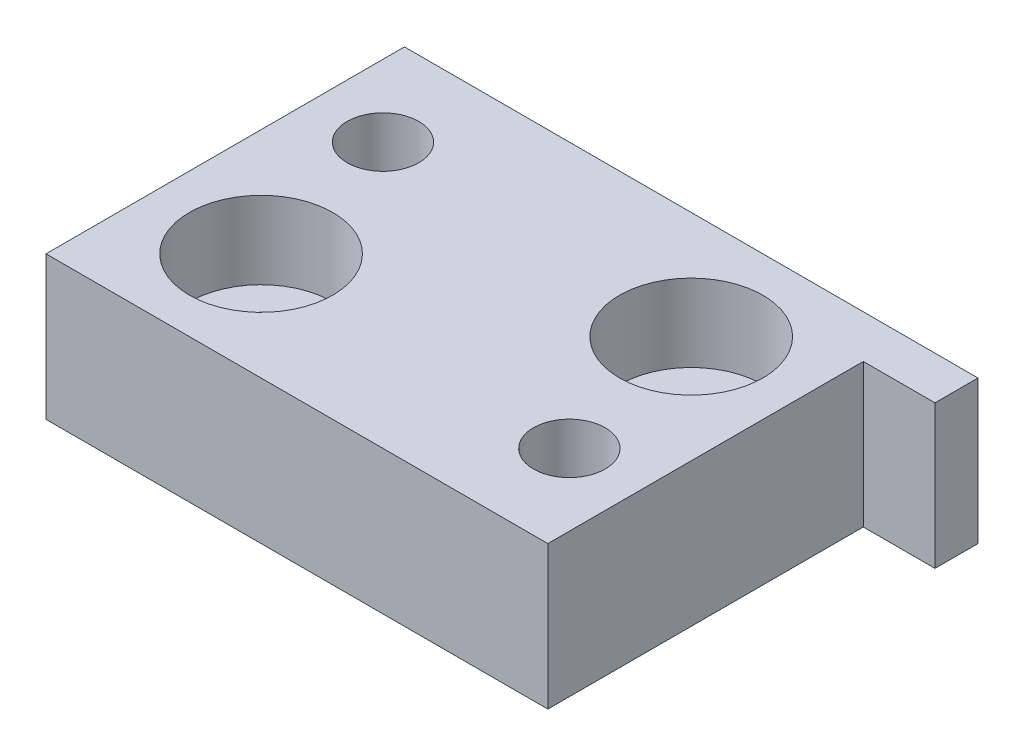
ISO-10303-21;
HEADER;
FILE_DESCRIPTION(('STEP AP214'),'2;1');
FILE_NAME('part.step','',(''),(''),'','','');
FILE_SCHEMA(('AUTOMOTIVE_DESIGN { 1 0 10303 214 1 1 1 1 }'));
ENDSEC;
DATA;
#1=APPLICATION_CONTEXT('core data for automotive mechanical design processes');
#2=APPLICATION_PROTOCOL_DEFINITION('international standard','automotive_design',2000,#1);
#3=PRODUCT_CONTEXT('',#1,'mechanical');
#4=PRODUCT('Part','Part','',(#3));
#5=PRODUCT_RELATED_PRODUCT_CATEGORY('part','',(#4));
#6=PRODUCT_DEFINITION_FORMATION('','',#4);
#7=PRODUCT_DEFINITION_CONTEXT('part definition',#1,'design');
#8=PRODUCT_DEFINITION('design','',#6,#7);
#9=PRODUCT_DEFINITION_SHAPE('','',#8);
#10=(LENGTH_UNIT() NAMED_UNIT(*) SI_UNIT(.MILLI.,.METRE.));
#11=(NAMED_UNIT(*) PLANE_ANGLE_UNIT() SI_UNIT($,.RADIAN.));
#12=(NAMED_UNIT(*) SI_UNIT($,.STERADIAN.) SOLID_ANGLE_UNIT());
#13=UNCERTAINTY_MEASURE_WITH_UNIT(LENGTH_MEASURE(1.E-05),#10,'distance_accuracy_value','');
#14=(GEOMETRIC_REPRESENTATION_CONTEXT(3) GLOBAL_UNCERTAINTY_ASSIGNED_CONTEXT((#13)) GLOBAL_UNIT_ASSIGNED_CONTEXT((#10,
#11,#12)) REPRESENTATION_CONTEXT('',''));
#15=CARTESIAN_POINT('',(0.,0.,0.));
#16=DIRECTION('',(0.,0.,1.));
#17=DIRECTION('',(1.,0.,0.));
#18=AXIS2_PLACEMENT_3D('',#15,#16,#17);
#19=CARTESIAN_POINT('',(20.,10.,12.5));
#20=DIRECTION('',(-1.,0.,0.));
#21=DIRECTION('',(0.,0.,1.));
#22=AXIS2_PLACEMENT_3D('',#19,#20,#21);
#23=PLANE('',#22);
#24=DIRECTION('',(0.,0.,-1.));
#25=VECTOR('',#24,1.);
#26=CARTESIAN_POINT('',(20.,10.,12.5));
#27=LINE('',#26,#25);
#28=CARTESIAN_POINT('',(20.,10.,-9.5));
#29=VERTEX_POINT('',#28);
#30=CARTESIAN_POINT('',(20.,10.,-12.5));
#31=VERTEX_POINT('',#30);
#32=EDGE_CURVE('E84',#29,#31,#27,.T.);
#33=ORIENTED_EDGE('',*,*,#32,.F.);
#34=DIRECTION('',(0.,1.,0.));
#35=VECTOR('',#34,1.);
#36=CARTESIAN_POINT('',(20.,-0.000999999999999265,-9.5));
#37=LINE('',#36,#35);
#38=CARTESIAN_POINT('',(20.,0.,-9.5));
#39=VERTEX_POINT('',#38);
#40=EDGE_CURVE('E139',#39,#29,#37,.T.);
#41=ORIENTED_EDGE('',*,*,#40,.F.);
#42=DIRECTION('',(0.,0.,-1.));
#43=VECTOR('',#42,1.);
#44=CARTESIAN_POINT('',(20.,0.,12.5));
#45=LINE('',#44,#43);
#46=CARTESIAN_POINT('',(20.,0.,-12.5));
#47=VERTEX_POINT('',#46);
#48=EDGE_CURVE('E134',#39,#47,#45,.T.);
#49=ORIENTED_EDGE('',*,*,#48,.T.);
#50=DIRECTION('',(0.,-1.,0.));
#51=VECTOR('',#50,1.);
#52=CARTESIAN_POINT('',(20.,10.,-12.5));
#53=LINE('',#52,#51);
#54=EDGE_CURVE('E11',#31,#47,#53,.T.);
#55=ORIENTED_EDGE('',*,*,#54,.F.);
#56=EDGE_LOOP('',(#33,#41,#49,#55));
#57=FACE_BOUND('',#56,.T.);
#58=ADVANCED_FACE('F39',(#57),#23,.F.);
#59=CARTESIAN_POINT('',(-20.,10.,-12.5));
#60=DIRECTION('',(0.,0.,1.));
#61=DIRECTION('',(1.,0.,0.));
#62=AXIS2_PLACEMENT_3D('',#59,#60,#61);
#63=PLANE('',#62);
#64=DIRECTION('',(-1.,0.,0.));
#65=VECTOR('',#64,1.);
#66=CARTESIAN_POINT('',(-20.,0.,-12.5));
#67=LINE('',#66,#65);
#68=CARTESIAN_POINT('',(-20.,0.,-12.5));
#69=VERTEX_POINT('',#68);
#70=EDGE_CURVE('E125',#47,#69,#67,.T.);
#71=ORIENTED_EDGE('',*,*,#70,.T.);
#72=DIRECTION('',(0.,-1.,0.));
#73=VECTOR('',#72,1.);
#74=CARTESIAN_POINT('',(-20.,10.,-12.5));
#75=LINE('',#74,#73);
#76=CARTESIAN_POINT('',(-20.,10.,-12.5));
#77=VERTEX_POINT('',#76);
#78=EDGE_CURVE('E46',#77,#69,#75,.T.);
#79=ORIENTED_EDGE('',*,*,#78,.F.);
#80=DIRECTION('',(-1.,0.,0.));
#81=VECTOR('',#80,1.);
#82=CARTESIAN_POINT('',(-20.,10.,-12.5));
#83=LINE('',#82,#81);
#84=EDGE_CURVE('E123',#31,#77,#83,.T.);
#85=ORIENTED_EDGE('',*,*,#84,.F.);
#86=ORIENTED_EDGE('',*,*,#54,.T.);
#87=EDGE_LOOP('',(#71,#79,#85,#86));
#88=FACE_BOUND('',#87,.T.);
#89=ADVANCED_FACE('F136',(#88),#63,.F.);
#90=CARTESIAN_POINT('',(-20.,10.,12.5));
#91=DIRECTION('',(1.,0.,0.));
#92=DIRECTION('',(0.,0.,-1.));
#93=AXIS2_PLACEMENT_3D('',#90,#91,#92);
#94=PLANE('',#93);
#95=DIRECTION('',(0.,0.,1.));
#96=VECTOR('',#95,1.);
#97=CARTESIAN_POINT('',(-20.,0.,12.5));
#98=LINE('',#97,#96);
#99=CARTESIAN_POINT('',(-20.,0.,12.5));
#100=VERTEX_POINT('',#99);
#101=EDGE_CURVE('E79',#69,#100,#98,.T.);
#102=ORIENTED_EDGE('',*,*,#101,.T.);
#103=DIRECTION('',(0.,-1.,0.));
#104=VECTOR('',#103,1.);
#105=CARTESIAN_POINT('',(-20.,10.,12.5));
#106=LINE('',#105,#104);
#107=CARTESIAN_POINT('',(-20.,10.,12.5));
#108=VERTEX_POINT('',#107);
#109=EDGE_CURVE('E121',#108,#100,#106,.T.);
#110=ORIENTED_EDGE('',*,*,#109,.F.);
#111=DIRECTION('',(0.,0.,1.));
#112=VECTOR('',#111,1.);
#113=CARTESIAN_POINT('',(-20.,10.,12.5));
#114=LINE('',#113,#112);
#115=EDGE_CURVE('E62',#77,#108,#114,.T.);
#116=ORIENTED_EDGE('',*,*,#115,.F.);
#117=ORIENTED_EDGE('',*,*,#78,.T.);
#118=EDGE_LOOP('',(#102,#110,#116,#117));
#119=FACE_BOUND('',#118,.T.);
#120=ADVANCED_FACE('F131',(#119),#94,.F.);
#121=CARTESIAN_POINT('',(-20.,10.,12.5));
#122=DIRECTION('',(0.,0.,-1.));
#123=DIRECTION('',(-1.,0.,0.));
#124=AXIS2_PLACEMENT_3D('',#121,#122,#123);
#125=PLANE('',#124);
#126=DIRECTION('',(1.,0.,0.));
#127=VECTOR('',#126,1.);
#128=CARTESIAN_POINT('',(-20.,0.,12.5));
#129=LINE('',#128,#127);
#130=CARTESIAN_POINT('',(15.,0.,12.5));
#131=VERTEX_POINT('',#130);
#132=EDGE_CURVE('E115',#100,#131,#129,.T.);
#133=ORIENTED_EDGE('',*,*,#132,.T.);
#134=DIRECTION('',(0.,1.,0.));
#135=VECTOR('',#134,1.);
#136=CARTESIAN_POINT('',(15.,-0.000999999999999265,12.5));
#137=LINE('',#136,#135);
#138=CARTESIAN_POINT('',(15.,10.,12.5));
#139=VERTEX_POINT('',#138);
#140=EDGE_CURVE('E100',#131,#139,#137,.T.);
#141=ORIENTED_EDGE('',*,*,#140,.T.);
#142=DIRECTION('',(1.,0.,0.));
#143=VECTOR('',#142,1.);
#144=CARTESIAN_POINT('',(-20.,10.,12.5));
#145=LINE('',#144,#143);
#146=EDGE_CURVE('E129',#108,#139,#145,.T.);
#147=ORIENTED_EDGE('',*,*,#146,.F.);
#148=ORIENTED_EDGE('',*,*,#109,.T.);
#149=EDGE_LOOP('',(#133,#141,#147,#148));
#150=FACE_BOUND('',#149,.T.);
#151=ADVANCED_FACE('F120',(#150),#125,.F.);
#152=CARTESIAN_POINT('',(0.,10.,0.));
#153=DIRECTION('',(0.,-1.,0.));
#154=DIRECTION('',(0.,0.,-1.));
#155=AXIS2_PLACEMENT_3D('',#152,#153,#154);
#156=PLANE('',#155);
#157=CARTESIAN_POINT('',(-12.5,10.,5.));
#158=DIRECTION('',(0.,1.,0.));
#159=DIRECTION('',(0.,0.,1.));
#160=AXIS2_PLACEMENT_3D('',#157,#158,#159);
#161=CIRCLE('',#160,5.);
#162=CARTESIAN_POINT('',(-12.5,10.,10.));
#163=VERTEX_POINT('',#162);
#164=EDGE_CURVE('E182',#163,#163,#161,.T.);
#165=ORIENTED_EDGE('',*,*,#164,.F.);
#166=EDGE_LOOP('',(#165));
#167=FACE_BOUND('',#166,.T.);
#168=CARTESIAN_POINT('',(7.5,10.,-5.));
#169=DIRECTION('',(0.,1.,0.));
#170=DIRECTION('',(0.,0.,1.));
#171=AXIS2_PLACEMENT_3D('',#168,#169,#170);
#172=CIRCLE('',#171,5.);
#173=CARTESIAN_POINT('',(7.5,10.,0.));
#174=VERTEX_POINT('',#173);
#175=EDGE_CURVE('E170',#174,#174,#172,.T.);
#176=ORIENTED_EDGE('',*,*,#175,.F.);
#177=EDGE_LOOP('',(#176));
#178=FACE_BOUND('',#177,.T.);
#179=CARTESIAN_POINT('',(9.99999999999999,10.,6.));
#180=DIRECTION('',(0.,1.,0.));
#181=DIRECTION('',(0.,0.,1.));
#182=AXIS2_PLACEMENT_3D('',#179,#180,#181);
#183=CIRCLE('',#182,2.5);
#184=CARTESIAN_POINT('',(9.99999999999999,10.,8.49999999999999));
#185=VERTEX_POINT('',#184);
#186=EDGE_CURVE('E158',#185,#185,#183,.T.);
#187=ORIENTED_EDGE('',*,*,#186,.F.);
#188=EDGE_LOOP('',(#187));
#189=FACE_BOUND('',#188,.T.);
#190=CARTESIAN_POINT('',(-15.,10.,-6.));
#191=DIRECTION('',(0.,1.,0.));
#192=DIRECTION('',(0.,0.,1.));
#193=AXIS2_PLACEMENT_3D('',#190,#191,#192);
#194=CIRCLE('',#193,2.5);
#195=CARTESIAN_POINT('',(-15.,10.,-3.5));
#196=VERTEX_POINT('',#195);
#197=EDGE_CURVE('E152',#196,#196,#194,.T.);
#198=ORIENTED_EDGE('',*,*,#197,.F.);
#199=EDGE_LOOP('',(#198));
#200=FACE_BOUND('',#199,.T.);
#201=ORIENTED_EDGE('',*,*,#146,.T.);
#202=DIRECTION('',(0.,0.,1.));
#203=VECTOR('',#202,1.);
#204=CARTESIAN_POINT('',(15.,10.,12.5));
#205=LINE('',#204,#203);
#206=CARTESIAN_POINT('',(15.,10.,-9.5));
#207=VERTEX_POINT('',#206);
#208=EDGE_CURVE('E106',#207,#139,#205,.T.);
#209=ORIENTED_EDGE('',*,*,#208,.F.);
#210=DIRECTION('',(-1.,0.,0.));
#211=VECTOR('',#210,1.);
#212=CARTESIAN_POINT('',(20.,10.,-9.5));
#213=LINE('',#212,#211);
#214=EDGE_CURVE('E117',#29,#207,#213,.T.);
#215=ORIENTED_EDGE('',*,*,#214,.F.);
#216=ORIENTED_EDGE('',*,*,#32,.T.);
#217=ORIENTED_EDGE('',*,*,#84,.T.);
#218=ORIENTED_EDGE('',*,*,#115,.T.);
#219=EDGE_LOOP('',(#201,#209,#215,#216,#217,#218));
#220=FACE_BOUND('',#219,.T.);
#221=ADVANCED_FACE('F188',(#167,#178,#189,#200,#220),#156,.F.);
#222=CARTESIAN_POINT('',(0.,0.,0.));
#223=DIRECTION('',(0.,-1.,0.));
#224=DIRECTION('',(0.,0.,-1.));
#225=AXIS2_PLACEMENT_3D('',#222,#223,#224);
#226=PLANE('',#225);
#227=CARTESIAN_POINT('',(-12.5,0.,5.));
#228=DIRECTION('',(0.,1.,0.));
#229=DIRECTION('',(0.,0.,1.));
#230=AXIS2_PLACEMENT_3D('',#227,#228,#229);
#231=CIRCLE('',#230,2.65);
#232=CARTESIAN_POINT('',(-12.5,0.,7.65));
#233=VERTEX_POINT('',#232);
#234=EDGE_CURVE('E173',#233,#233,#231,.T.);
#235=ORIENTED_EDGE('',*,*,#234,.T.);
#236=EDGE_LOOP('',(#235));
#237=FACE_BOUND('',#236,.T.);
#238=CARTESIAN_POINT('',(7.5,0.,-5.));
#239=DIRECTION('',(0.,1.,0.));
#240=DIRECTION('',(0.,0.,1.));
#241=AXIS2_PLACEMENT_3D('',#238,#239,#240);
#242=CIRCLE('',#241,2.65);
#243=CARTESIAN_POINT('',(7.5,0.,-2.35));
#244=VERTEX_POINT('',#243);
#245=EDGE_CURVE('E161',#244,#244,#242,.T.);
#246=ORIENTED_EDGE('',*,*,#245,.T.);
#247=EDGE_LOOP('',(#246));
#248=FACE_BOUND('',#247,.T.);
#249=CARTESIAN_POINT('',(9.99999999999999,0.,6.));
#250=DIRECTION('',(0.,1.,0.));
#251=DIRECTION('',(0.,0.,1.));
#252=AXIS2_PLACEMENT_3D('',#249,#250,#251);
#253=CIRCLE('',#252,2.5);
#254=CARTESIAN_POINT('',(9.99999999999999,0.,8.49999999999999));
#255=VERTEX_POINT('',#254);
#256=EDGE_CURVE('E155',#255,#255,#253,.T.);
#257=ORIENTED_EDGE('',*,*,#256,.T.);
#258=EDGE_LOOP('',(#257));
#259=FACE_BOUND('',#258,.T.);
#260=CARTESIAN_POINT('',(-15.,0.,-6.));
#261=DIRECTION('',(0.,1.,0.));
#262=DIRECTION('',(0.,0.,1.));
#263=AXIS2_PLACEMENT_3D('',#260,#261,#262);
#264=CIRCLE('',#263,2.5);
#265=CARTESIAN_POINT('',(-15.,0.,-3.5));
#266=VERTEX_POINT('',#265);
#267=EDGE_CURVE('E118',#266,#266,#264,.T.);
#268=ORIENTED_EDGE('',*,*,#267,.T.);
#269=EDGE_LOOP('',(#268));
#270=FACE_BOUND('',#269,.T.);
#271=DIRECTION('',(0.,0.,1.));
#272=VECTOR('',#271,1.);
#273=CARTESIAN_POINT('',(15.,0.,12.5));
#274=LINE('',#273,#272);
#275=CARTESIAN_POINT('',(15.,0.,-9.5));
#276=VERTEX_POINT('',#275);
#277=EDGE_CURVE('E103',#276,#131,#274,.T.);
#278=ORIENTED_EDGE('',*,*,#277,.T.);
#279=ORIENTED_EDGE('',*,*,#132,.F.);
#280=ORIENTED_EDGE('',*,*,#101,.F.);
#281=ORIENTED_EDGE('',*,*,#70,.F.);
#282=ORIENTED_EDGE('',*,*,#48,.F.);
#283=DIRECTION('',(-1.,0.,0.));
#284=VECTOR('',#283,1.);
#285=CARTESIAN_POINT('',(20.,0.,-9.5));
#286=LINE('',#285,#284);
#287=EDGE_CURVE('E110',#39,#276,#286,.T.);
#288=ORIENTED_EDGE('',*,*,#287,.T.);
#289=EDGE_LOOP('',(#278,#279,#280,#281,#282,#288));
#290=FACE_BOUND('',#289,.T.);
#291=ADVANCED_FACE('F114',(#237,#248,#259,#270,#290),#226,.T.);
#292=CARTESIAN_POINT('',(15.,-0.000999999999999265,12.5));
#293=DIRECTION('',(-1.,0.,0.));
#294=DIRECTION('',(0.,0.,1.));
#295=AXIS2_PLACEMENT_3D('',#292,#293,#294);
#296=PLANE('',#295);
#297=DIRECTION('',(0.,1.,0.));
#298=VECTOR('',#297,1.);
#299=CARTESIAN_POINT('',(15.,-0.000999999999999265,-9.5));
#300=LINE('',#299,#298);
#301=EDGE_CURVE('E53',#276,#207,#300,.T.);
#302=ORIENTED_EDGE('',*,*,#301,.T.);
#303=ORIENTED_EDGE('',*,*,#208,.T.);
#304=ORIENTED_EDGE('',*,*,#140,.F.);
#305=ORIENTED_EDGE('',*,*,#277,.F.);
#306=EDGE_LOOP('',(#302,#303,#304,#305));
#307=FACE_BOUND('',#306,.T.);
#308=ADVANCED_FACE('F102',(#307),#296,.F.);
#309=CARTESIAN_POINT('',(20.,-0.000999999999999265,-9.5));
#310=DIRECTION('',(0.,0.,-1.));
#311=DIRECTION('',(-1.,0.,0.));
#312=AXIS2_PLACEMENT_3D('',#309,#310,#311);
#313=PLANE('',#312);
#314=ORIENTED_EDGE('',*,*,#40,.T.);
#315=ORIENTED_EDGE('',*,*,#214,.T.);
#316=ORIENTED_EDGE('',*,*,#301,.F.);
#317=ORIENTED_EDGE('',*,*,#287,.F.);
#318=EDGE_LOOP('',(#314,#315,#316,#317));
#319=FACE_BOUND('',#318,.T.);
#320=ADVANCED_FACE('F197',(#319),#313,.F.);
#321=CARTESIAN_POINT('',(-15.,10.,-6.));
#322=DIRECTION('',(0.,1.,0.));
#323=DIRECTION('',(0.,0.,1.));
#324=AXIS2_PLACEMENT_3D('',#321,#322,#323);
#325=CYLINDRICAL_SURFACE('',#324,2.5);
#326=ORIENTED_EDGE('',*,*,#267,.F.);
#327=EDGE_LOOP('',(#326));
#328=FACE_BOUND('',#327,.T.);
#329=ORIENTED_EDGE('',*,*,#197,.T.);
#330=EDGE_LOOP('',(#329));
#331=FACE_BOUND('',#330,.T.);
#332=ADVANCED_FACE('F199',(#328,#331),#325,.F.);
#333=CARTESIAN_POINT('',(9.99999999999999,10.,6.));
#334=DIRECTION('',(0.,1.,0.));
#335=DIRECTION('',(0.,0.,1.));
#336=AXIS2_PLACEMENT_3D('',#333,#334,#335);
#337=CYLINDRICAL_SURFACE('',#336,2.5);
#338=ORIENTED_EDGE('',*,*,#256,.F.);
#339=EDGE_LOOP('',(#338));
#340=FACE_BOUND('',#339,.T.);
#341=ORIENTED_EDGE('',*,*,#186,.T.);
#342=EDGE_LOOP('',(#341));
#343=FACE_BOUND('',#342,.T.);
#344=ADVANCED_FACE('F205',(#340,#343),#337,.F.);
#345=CARTESIAN_POINT('',(7.5,10.,-5.));
#346=DIRECTION('',(0.,1.,0.));
#347=DIRECTION('',(0.,0.,1.));
#348=AXIS2_PLACEMENT_3D('',#345,#346,#347);
#349=CYLINDRICAL_SURFACE('',#348,2.65);
#350=ORIENTED_EDGE('',*,*,#245,.F.);
#351=EDGE_LOOP('',(#350));
#352=FACE_BOUND('',#351,.T.);
#353=CARTESIAN_POINT('',(7.5,4.6,-5.));
#354=DIRECTION('',(0.,1.,0.));
#355=DIRECTION('',(0.,0.,1.));
#356=AXIS2_PLACEMENT_3D('',#353,#354,#355);
#357=CIRCLE('',#356,2.65);
#358=CARTESIAN_POINT('',(7.5,4.6,-2.35));
#359=VERTEX_POINT('',#358);
#360=EDGE_CURVE('E164',#359,#359,#357,.T.);
#361=ORIENTED_EDGE('',*,*,#360,.T.);
#362=EDGE_LOOP('',(#361));
#363=FACE_BOUND('',#362,.T.);
#364=ADVANCED_FACE('F236',(#352,#363),#349,.F.);
#365=CARTESIAN_POINT('',(10.15,4.6,-5.));
#366=DIRECTION('',(0.,-1.,0.));
#367=DIRECTION('',(0.,0.,-1.));
#368=AXIS2_PLACEMENT_3D('',#365,#366,#367);
#369=PLANE('',#368);
#370=ORIENTED_EDGE('',*,*,#360,.F.);
#371=EDGE_LOOP('',(#370));
#372=FACE_BOUND('',#371,.T.);
#373=CARTESIAN_POINT('',(7.5,4.6,-5.));
#374=DIRECTION('',(0.,1.,0.));
#375=DIRECTION('',(0.,0.,1.));
#376=AXIS2_PLACEMENT_3D('',#373,#374,#375);
#377=CIRCLE('',#376,5.);
#378=CARTESIAN_POINT('',(7.5,4.6,0.));
#379=VERTEX_POINT('',#378);
#380=EDGE_CURVE('E167',#379,#379,#377,.T.);
#381=ORIENTED_EDGE('',*,*,#380,.T.);
#382=EDGE_LOOP('',(#381));
#383=FACE_BOUND('',#382,.T.);
#384=ADVANCED_FACE('F240',(#372,#383),#369,.F.);
#385=CARTESIAN_POINT('',(7.5,10.,-5.));
#386=DIRECTION('',(0.,1.,0.));
#387=DIRECTION('',(0.,0.,1.));
#388=AXIS2_PLACEMENT_3D('',#385,#386,#387);
#389=CYLINDRICAL_SURFACE('',#388,5.);
#390=ORIENTED_EDGE('',*,*,#380,.F.);
#391=EDGE_LOOP('',(#390));
#392=FACE_BOUND('',#391,.T.);
#393=ORIENTED_EDGE('',*,*,#175,.T.);
#394=EDGE_LOOP('',(#393));
#395=FACE_BOUND('',#394,.T.);
#396=ADVANCED_FACE('F246',(#392,#395),#389,.F.);
#397=CARTESIAN_POINT('',(-12.5,10.,5.));
#398=DIRECTION('',(0.,1.,0.));
#399=DIRECTION('',(0.,0.,1.));
#400=AXIS2_PLACEMENT_3D('',#397,#398,#399);
#401=CYLINDRICAL_SURFACE('',#400,2.65);
#402=ORIENTED_EDGE('',*,*,#234,.F.);
#403=EDGE_LOOP('',(#402));
#404=FACE_BOUND('',#403,.T.);
#405=CARTESIAN_POINT('',(-12.5,4.6,5.));
#406=DIRECTION('',(0.,1.,0.));
#407=DIRECTION('',(0.,0.,1.));
#408=AXIS2_PLACEMENT_3D('',#405,#406,#407);
#409=CIRCLE('',#408,2.65);
#410=CARTESIAN_POINT('',(-12.5,4.6,7.65));
#411=VERTEX_POINT('',#410);
#412=EDGE_CURVE('E176',#411,#411,#409,.T.);
#413=ORIENTED_EDGE('',*,*,#412,.T.);
#414=EDGE_LOOP('',(#413));
#415=FACE_BOUND('',#414,.T.);
#416=ADVANCED_FACE('F250',(#404,#415),#401,.F.);
#417=CARTESIAN_POINT('',(-9.85,4.6,5.));
#418=DIRECTION('',(0.,-1.,0.));
#419=DIRECTION('',(0.,0.,-1.));
#420=AXIS2_PLACEMENT_3D('',#417,#418,#419);
#421=PLANE('',#420);
#422=ORIENTED_EDGE('',*,*,#412,.F.);
#423=EDGE_LOOP('',(#422));
#424=FACE_BOUND('',#423,.T.);
#425=CARTESIAN_POINT('',(-12.5,4.6,5.));
#426=DIRECTION('',(0.,1.,0.));
#427=DIRECTION('',(0.,0.,1.));
#428=AXIS2_PLACEMENT_3D('',#425,#426,#427);
#429=CIRCLE('',#428,5.);
#430=CARTESIAN_POINT('',(-12.5,4.6,10.));
#431=VERTEX_POINT('',#430);
#432=EDGE_CURVE('E179',#431,#431,#429,.T.);
#433=ORIENTED_EDGE('',*,*,#432,.T.);
#434=EDGE_LOOP('',(#433));
#435=FACE_BOUND('',#434,.T.);
#436=ADVANCED_FACE('F254',(#424,#435),#421,.F.);
#437=CARTESIAN_POINT('',(-12.5,10.,5.));
#438=DIRECTION('',(0.,1.,0.));
#439=DIRECTION('',(0.,0.,1.));
#440=AXIS2_PLACEMENT_3D('',#437,#438,#439);
#441=CYLINDRICAL_SURFACE('',#440,5.);
#442=ORIENTED_EDGE('',*,*,#432,.F.);
#443=EDGE_LOOP('',(#442));
#444=FACE_BOUND('',#443,.T.);
#445=ORIENTED_EDGE('',*,*,#164,.T.);
#446=EDGE_LOOP('',(#445));
#447=FACE_BOUND('',#446,.T.);
#448=ADVANCED_FACE('F186',(#444,#447),#441,.F.);
#449=CLOSED_SHELL('',(#58,#89,#120,#151,#221,#291,#308,#320,#332,#344,#364,#384,#396,#416,#436,#448));
#450=MANIFOLD_SOLID_BREP('B2',#449);
#451=ADVANCED_BREP_SHAPE_REPRESENTATION('',(#18,#450),#14);
#452=SHAPE_DEFINITION_REPRESENTATION(#9,#451);
ENDSEC;
END-ISO-10303-21;
